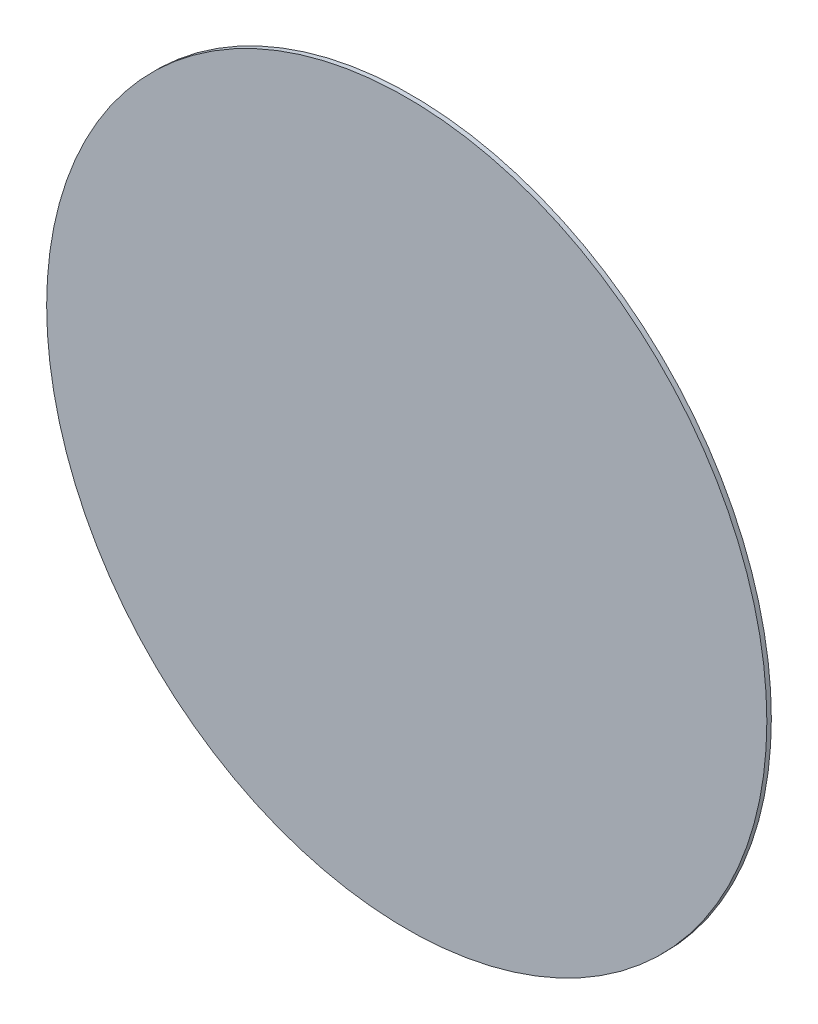
ISO-10303-21;
HEADER;
FILE_DESCRIPTION(('STEP AP214'),'2;1');
FILE_NAME('part.step','',(''),(''),'','','');
FILE_SCHEMA(('AUTOMOTIVE_DESIGN { 1 0 10303 214 1 1 1 1 }'));
ENDSEC;
DATA;
#1=APPLICATION_CONTEXT('core data for automotive mechanical design processes');
#2=APPLICATION_PROTOCOL_DEFINITION('international standard','automotive_design',2000,#1);
#3=PRODUCT_CONTEXT('',#1,'mechanical');
#4=PRODUCT('Part','Part','',(#3));
#5=PRODUCT_RELATED_PRODUCT_CATEGORY('part','',(#4));
#6=PRODUCT_DEFINITION_FORMATION('','',#4);
#7=PRODUCT_DEFINITION_CONTEXT('part definition',#1,'design');
#8=PRODUCT_DEFINITION('design','',#6,#7);
#9=PRODUCT_DEFINITION_SHAPE('','',#8);
#10=(LENGTH_UNIT() NAMED_UNIT(*) SI_UNIT(.MILLI.,.METRE.));
#11=(NAMED_UNIT(*) PLANE_ANGLE_UNIT() SI_UNIT($,.RADIAN.));
#12=(NAMED_UNIT(*) SI_UNIT($,.STERADIAN.) SOLID_ANGLE_UNIT());
#13=UNCERTAINTY_MEASURE_WITH_UNIT(LENGTH_MEASURE(1.E-05),#10,'distance_accuracy_value','');
#14=(GEOMETRIC_REPRESENTATION_CONTEXT(3) GLOBAL_UNCERTAINTY_ASSIGNED_CONTEXT((#13)) GLOBAL_UNIT_ASSIGNED_CONTEXT((#10,
#11,#12)) REPRESENTATION_CONTEXT('',''));
#15=CARTESIAN_POINT('',(0.,0.,0.));
#16=DIRECTION('',(0.,0.,1.));
#17=DIRECTION('',(1.,0.,0.));
#18=AXIS2_PLACEMENT_3D('',#15,#16,#17);
#19=CARTESIAN_POINT('',(-1632.204,0.,-99.9999999999998));
#20=DIRECTION('',(0.,0.,-1.));
#21=DIRECTION('',(0.707106781186547,0.707106781186547,0.));
#22=AXIS2_PLACEMENT_3D('',#19,#20,#21);
#23=PLANE('',#22);
#24=CARTESIAN_POINT('',(-1.28989959180099E-13,0.,-99.9999999999998));
#25=DIRECTION('',(0.,0.,1.));
#26=DIRECTION('',(1.,0.,0.));
#27=AXIS2_PLACEMENT_3D('',#24,#25,#26);
#28=CIRCLE('',#27,800.);
#29=CARTESIAN_POINT('',(800.,0.,-99.9999999999998));
#30=VERTEX_POINT('',#29);
#31=EDGE_CURVE('E19',#30,#30,#28,.T.);
#32=ORIENTED_EDGE('',*,*,#31,.T.);
#33=EDGE_LOOP('',(#32));
#34=FACE_BOUND('',#33,.T.);
#35=ADVANCED_FACE('F15',(#34),#23,.F.);
#36=CARTESIAN_POINT('',(-1.28989959180099E-13,0.,-110.));
#37=DIRECTION('',(0.,0.,1.));
#38=DIRECTION('',(1.,0.,0.));
#39=AXIS2_PLACEMENT_3D('',#36,#37,#38);
#40=CYLINDRICAL_SURFACE('',#39,800.);
#41=CARTESIAN_POINT('',(-1.28989959180099E-13,0.,-110.));
#42=DIRECTION('',(0.,0.,1.));
#43=DIRECTION('',(1.,0.,0.));
#44=AXIS2_PLACEMENT_3D('',#41,#42,#43);
#45=CIRCLE('',#44,800.);
#46=CARTESIAN_POINT('',(800.,0.,-110.));
#47=VERTEX_POINT('',#46);
#48=EDGE_CURVE('E10',#47,#47,#45,.T.);
#49=ORIENTED_EDGE('',*,*,#48,.T.);
#50=EDGE_LOOP('',(#49));
#51=FACE_BOUND('',#50,.T.);
#52=ORIENTED_EDGE('',*,*,#31,.F.);
#53=EDGE_LOOP('',(#52));
#54=FACE_BOUND('',#53,.T.);
#55=ADVANCED_FACE('F29',(#51,#54),#40,.T.);
#56=CARTESIAN_POINT('',(0.,1632.204,-110.));
#57=DIRECTION('',(0.,0.,1.));
#58=DIRECTION('',(-0.707106781186547,-0.707106781186547,0.));
#59=AXIS2_PLACEMENT_3D('',#56,#57,#58);
#60=PLANE('',#59);
#61=ORIENTED_EDGE('',*,*,#48,.F.);
#62=EDGE_LOOP('',(#61));
#63=FACE_BOUND('',#62,.T.);
#64=ADVANCED_FACE('F17',(#63),#60,.F.);
#65=CLOSED_SHELL('',(#35,#55,#64));
#66=MANIFOLD_SOLID_BREP('B1',#65);
#67=ADVANCED_BREP_SHAPE_REPRESENTATION('',(#18,#66),#14);
#68=SHAPE_DEFINITION_REPRESENTATION(#9,#67);
ENDSEC;
END-ISO-10303-21;
